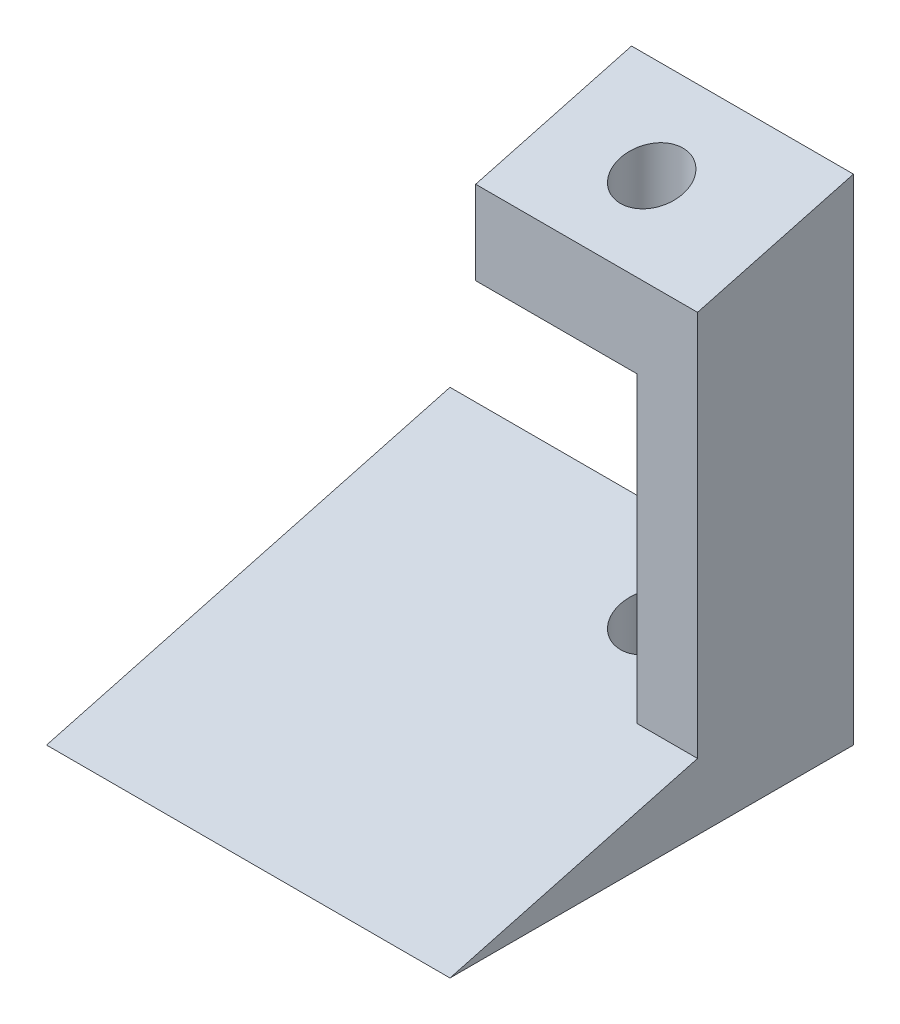
ISO-10303-21;
HEADER;
FILE_DESCRIPTION(('STEP AP214'),'2;1');
FILE_NAME('part.step','',(''),(''),'','','');
FILE_SCHEMA(('AUTOMOTIVE_DESIGN { 1 0 10303 214 1 1 1 1 }'));
ENDSEC;
DATA;
#1=APPLICATION_CONTEXT('core data for automotive mechanical design processes');
#2=APPLICATION_PROTOCOL_DEFINITION('international standard','automotive_design',2000,#1);
#3=PRODUCT_CONTEXT('',#1,'mechanical');
#4=PRODUCT('Part','Part','',(#3));
#5=PRODUCT_RELATED_PRODUCT_CATEGORY('part','',(#4));
#6=PRODUCT_DEFINITION_FORMATION('','',#4);
#7=PRODUCT_DEFINITION_CONTEXT('part definition',#1,'design');
#8=PRODUCT_DEFINITION('design','',#6,#7);
#9=PRODUCT_DEFINITION_SHAPE('','',#8);
#10=(LENGTH_UNIT() NAMED_UNIT(*) SI_UNIT(.MILLI.,.METRE.));
#11=(NAMED_UNIT(*) PLANE_ANGLE_UNIT() SI_UNIT($,.RADIAN.));
#12=(NAMED_UNIT(*) SI_UNIT($,.STERADIAN.) SOLID_ANGLE_UNIT());
#13=UNCERTAINTY_MEASURE_WITH_UNIT(LENGTH_MEASURE(1.E-05),#10,'distance_accuracy_value','');
#14=(GEOMETRIC_REPRESENTATION_CONTEXT(3) GLOBAL_UNCERTAINTY_ASSIGNED_CONTEXT((#13)) GLOBAL_UNIT_ASSIGNED_CONTEXT((#10,
#11,#12)) REPRESENTATION_CONTEXT('',''));
#15=CARTESIAN_POINT('',(0.,0.,0.));
#16=DIRECTION('',(0.,0.,1.));
#17=DIRECTION('',(1.,0.,0.));
#18=AXIS2_PLACEMENT_3D('',#15,#16,#17);
#19=CARTESIAN_POINT('',(17.,0.,0.));
#20=DIRECTION('',(1.,0.,0.));
#21=DIRECTION('',(0.,0.,-1.));
#22=AXIS2_PLACEMENT_3D('',#19,#20,#21);
#23=PLANE('',#22);
#24=DIRECTION('',(0.,-0.258819045102514,0.96592582628907));
#25=VECTOR('',#24,1.);
#26=CARTESIAN_POINT('',(17.,20.3704884645685,-20.));
#27=LINE('',#26,#25);
#28=CARTESIAN_POINT('',(17.,20.3704884645685,-20.));
#29=VERTEX_POINT('',#28);
#30=CARTESIAN_POINT('',(17.,18.2999361037484,-12.2725933896874));
#31=VERTEX_POINT('',#30);
#32=EDGE_CURVE('E128',#29,#31,#27,.T.);
#33=ORIENTED_EDGE('',*,*,#32,.F.);
#34=DIRECTION('',(0.,1.,0.));
#35=VECTOR('',#34,1.);
#36=CARTESIAN_POINT('',(17.,5.35898384862232,-20.));
#37=LINE('',#36,#35);
#38=CARTESIAN_POINT('',(17.,5.35898384862232,-20.));
#39=VERTEX_POINT('',#38);
#40=EDGE_CURVE('E49',#39,#29,#37,.T.);
#41=ORIENTED_EDGE('',*,*,#40,.F.);
#42=DIRECTION('',(0.,0.258819045102515,-0.96592582628907));
#43=VECTOR('',#42,1.);
#44=CARTESIAN_POINT('',(17.,5.35898384862232,-20.));
#45=LINE('',#44,#43);
#46=CARTESIAN_POINT('',(17.,3.2884314878022,-12.2725933896874));
#47=VERTEX_POINT('',#46);
#48=EDGE_CURVE('E80',#47,#39,#45,.T.);
#49=ORIENTED_EDGE('',*,*,#48,.F.);
#50=DIRECTION('',(0.,-1.,0.));
#51=VECTOR('',#50,1.);
#52=CARTESIAN_POINT('',(17.,22.4410408253887,-12.2725933896874));
#53=LINE('',#52,#51);
#54=EDGE_CURVE('E108',#31,#47,#53,.T.);
#55=ORIENTED_EDGE('',*,*,#54,.F.);
#56=EDGE_LOOP('',(#33,#41,#49,#55));
#57=FACE_BOUND('',#56,.T.);
#58=ADVANCED_FACE('F33',(#57),#23,.F.);
#59=CARTESIAN_POINT('',(20.,5.35898384862232,-20.));
#60=DIRECTION('',(0.,-0.96592582628907,-0.258819045102515));
#61=DIRECTION('',(0.,0.258819045102515,-0.96592582628907));
#62=AXIS2_PLACEMENT_3D('',#59,#60,#61);
#63=PLANE('',#62);
#64=CARTESIAN_POINT('',(14.,4.28718707889785,-16.));
#65=DIRECTION('',(0.,-0.96592582628907,-0.258819045102515));
#66=DIRECTION('',(0.,-0.258819045102515,0.96592582628907));
#67=AXIS2_PLACEMENT_3D('',#64,#65,#66);
#68=ELLIPSE('',#67,1.60467807963562,1.55);
#69=CARTESIAN_POINT('',(14.,3.87186583062962,-14.45));
#70=VERTEX_POINT('',#69);
#71=EDGE_CURVE('E132',#70,#70,#68,.T.);
#72=ORIENTED_EDGE('',*,*,#71,.T.);
#73=EDGE_LOOP('',(#72));
#74=FACE_BOUND('',#73,.T.);
#75=DIRECTION('',(1.,0.,0.));
#76=VECTOR('',#75,1.);
#77=CARTESIAN_POINT('',(17.,3.2884314878022,-12.2725933896874));
#78=LINE('',#77,#76);
#79=CARTESIAN_POINT('',(20.,3.2884314878022,-12.2725933896874));
#80=VERTEX_POINT('',#79);
#81=EDGE_CURVE('E94',#47,#80,#78,.T.);
#82=ORIENTED_EDGE('',*,*,#81,.F.);
#83=ORIENTED_EDGE('',*,*,#48,.T.);
#84=DIRECTION('',(-1.,0.,0.));
#85=VECTOR('',#84,1.);
#86=CARTESIAN_POINT('',(20.,5.35898384862232,-20.));
#87=LINE('',#86,#85);
#88=CARTESIAN_POINT('',(0.,5.35898384862232,-20.));
#89=VERTEX_POINT('',#88);
#90=EDGE_CURVE('E74',#39,#89,#87,.T.);
#91=ORIENTED_EDGE('',*,*,#90,.T.);
#92=DIRECTION('',(0.,-0.258819045102515,0.96592582628907));
#93=VECTOR('',#92,1.);
#94=CARTESIAN_POINT('',(0.,5.35898384862232,-20.));
#95=LINE('',#94,#93);
#96=CARTESIAN_POINT('',(0.,0.,0.));
#97=VERTEX_POINT('',#96);
#98=EDGE_CURVE('E79',#89,#97,#95,.T.);
#99=ORIENTED_EDGE('',*,*,#98,.T.);
#100=DIRECTION('',(-1.,0.,0.));
#101=VECTOR('',#100,1.);
#102=CARTESIAN_POINT('',(20.,0.,0.));
#103=LINE('',#102,#101);
#104=CARTESIAN_POINT('',(20.,0.,0.));
#105=VERTEX_POINT('',#104);
#106=EDGE_CURVE('E11',#105,#97,#103,.T.);
#107=ORIENTED_EDGE('',*,*,#106,.F.);
#108=DIRECTION('',(0.,-0.258819045102515,0.96592582628907));
#109=VECTOR('',#108,1.);
#110=CARTESIAN_POINT('',(20.,5.35898384862232,-20.));
#111=LINE('',#110,#109);
#112=EDGE_CURVE('E90',#80,#105,#111,.T.);
#113=ORIENTED_EDGE('',*,*,#112,.F.);
#114=EDGE_LOOP('',(#82,#83,#91,#99,#107,#113));
#115=FACE_BOUND('',#114,.T.);
#116=ADVANCED_FACE('F35',(#74,#115),#63,.F.);
#117=CARTESIAN_POINT('',(20.,0.,0.));
#118=DIRECTION('',(0.,1.,0.));
#119=DIRECTION('',(0.,0.,1.));
#120=AXIS2_PLACEMENT_3D('',#117,#118,#119);
#121=PLANE('',#120);
#122=CARTESIAN_POINT('',(14.,0.,-16.));
#123=DIRECTION('',(0.,-1.,0.));
#124=DIRECTION('',(0.,0.,-1.));
#125=AXIS2_PLACEMENT_3D('',#122,#123,#124);
#126=CIRCLE('',#125,1.55);
#127=CARTESIAN_POINT('',(14.,0.,-17.55));
#128=VERTEX_POINT('',#127);
#129=EDGE_CURVE('E148',#128,#128,#126,.T.);
#130=ORIENTED_EDGE('',*,*,#129,.F.);
#131=EDGE_LOOP('',(#130));
#132=FACE_BOUND('',#131,.T.);
#133=DIRECTION('',(0.,0.,-1.));
#134=VECTOR('',#133,1.);
#135=CARTESIAN_POINT('',(0.,0.,0.));
#136=LINE('',#135,#134);
#137=CARTESIAN_POINT('',(0.,0.,-20.));
#138=VERTEX_POINT('',#137);
#139=EDGE_CURVE('E91',#97,#138,#136,.T.);
#140=ORIENTED_EDGE('',*,*,#139,.T.);
#141=DIRECTION('',(-1.,0.,0.));
#142=VECTOR('',#141,1.);
#143=CARTESIAN_POINT('',(20.,0.,-20.));
#144=LINE('',#143,#142);
#145=CARTESIAN_POINT('',(20.,0.,-20.));
#146=VERTEX_POINT('',#145);
#147=EDGE_CURVE('E42',#146,#138,#144,.T.);
#148=ORIENTED_EDGE('',*,*,#147,.F.);
#149=DIRECTION('',(0.,0.,-1.));
#150=VECTOR('',#149,1.);
#151=CARTESIAN_POINT('',(20.,0.,0.));
#152=LINE('',#151,#150);
#153=EDGE_CURVE('E58',#105,#146,#152,.T.);
#154=ORIENTED_EDGE('',*,*,#153,.F.);
#155=ORIENTED_EDGE('',*,*,#106,.T.);
#156=EDGE_LOOP('',(#140,#148,#154,#155));
#157=FACE_BOUND('',#156,.T.);
#158=ADVANCED_FACE('F175',(#132,#157),#121,.F.);
#159=CARTESIAN_POINT('',(20.,0.,-20.));
#160=DIRECTION('',(0.,0.,1.));
#161=DIRECTION('',(1.,0.,0.));
#162=AXIS2_PLACEMENT_3D('',#159,#160,#161);
#163=PLANE('',#162);
#164=DIRECTION('',(0.,1.,0.));
#165=VECTOR('',#164,1.);
#166=CARTESIAN_POINT('',(0.,0.,-20.));
#167=LINE('',#166,#165);
#168=EDGE_CURVE('E86',#138,#89,#167,.T.);
#169=ORIENTED_EDGE('',*,*,#168,.T.);
#170=ORIENTED_EDGE('',*,*,#90,.F.);
#171=ORIENTED_EDGE('',*,*,#40,.T.);
#172=DIRECTION('',(1.,0.,0.));
#173=VECTOR('',#172,1.);
#174=CARTESIAN_POINT('',(9.,20.3704884645685,-20.));
#175=LINE('',#174,#173);
#176=CARTESIAN_POINT('',(9.,20.3704884645685,-20.));
#177=VERTEX_POINT('',#176);
#178=EDGE_CURVE('E117',#177,#29,#175,.T.);
#179=ORIENTED_EDGE('',*,*,#178,.F.);
#180=DIRECTION('',(0.,-1.,0.));
#181=VECTOR('',#180,1.);
#182=CARTESIAN_POINT('',(9.,24.5115931862088,-20.));
#183=LINE('',#182,#181);
#184=CARTESIAN_POINT('',(9.,24.5115931862088,-20.));
#185=VERTEX_POINT('',#184);
#186=EDGE_CURVE('E131',#185,#177,#183,.T.);
#187=ORIENTED_EDGE('',*,*,#186,.F.);
#188=DIRECTION('',(1.,0.,0.));
#189=VECTOR('',#188,1.);
#190=CARTESIAN_POINT('',(17.,24.5115931862088,-20.));
#191=LINE('',#190,#189);
#192=CARTESIAN_POINT('',(20.,24.5115931862088,-20.));
#193=VERTEX_POINT('',#192);
#194=EDGE_CURVE('E105',#185,#193,#191,.T.);
#195=ORIENTED_EDGE('',*,*,#194,.T.);
#196=DIRECTION('',(0.,1.,0.));
#197=VECTOR('',#196,1.);
#198=CARTESIAN_POINT('',(20.,0.,-20.));
#199=LINE('',#198,#197);
#200=EDGE_CURVE('E82',#146,#193,#199,.T.);
#201=ORIENTED_EDGE('',*,*,#200,.F.);
#202=ORIENTED_EDGE('',*,*,#147,.T.);
#203=EDGE_LOOP('',(#169,#170,#171,#179,#187,#195,#201,#202));
#204=FACE_BOUND('',#203,.T.);
#205=ADVANCED_FACE('F87',(#204),#163,.F.);
#206=CARTESIAN_POINT('',(20.,0.,0.));
#207=DIRECTION('',(-1.,0.,0.));
#208=DIRECTION('',(0.,0.,1.));
#209=AXIS2_PLACEMENT_3D('',#206,#207,#208);
#210=PLANE('',#209);
#211=ORIENTED_EDGE('',*,*,#200,.T.);
#212=DIRECTION('',(0.,-0.258819045102515,0.96592582628907));
#213=VECTOR('',#212,1.);
#214=CARTESIAN_POINT('',(20.,24.5115931862088,-20.));
#215=LINE('',#214,#213);
#216=CARTESIAN_POINT('',(20.,22.4410408253887,-12.2725933896874));
#217=VERTEX_POINT('',#216);
#218=EDGE_CURVE('E114',#193,#217,#215,.T.);
#219=ORIENTED_EDGE('',*,*,#218,.T.);
#220=DIRECTION('',(0.,-1.,0.));
#221=VECTOR('',#220,1.);
#222=CARTESIAN_POINT('',(20.,22.4410408253887,-12.2725933896874));
#223=LINE('',#222,#221);
#224=EDGE_CURVE('E111',#217,#80,#223,.T.);
#225=ORIENTED_EDGE('',*,*,#224,.T.);
#226=ORIENTED_EDGE('',*,*,#112,.T.);
#227=ORIENTED_EDGE('',*,*,#153,.T.);
#228=EDGE_LOOP('',(#211,#219,#225,#226,#227));
#229=FACE_BOUND('',#228,.T.);
#230=ADVANCED_FACE('F187',(#229),#210,.F.);
#231=CARTESIAN_POINT('',(0.,0.,0.));
#232=DIRECTION('',(-1.,0.,0.));
#233=DIRECTION('',(0.,0.,1.));
#234=AXIS2_PLACEMENT_3D('',#231,#232,#233);
#235=PLANE('',#234);
#236=ORIENTED_EDGE('',*,*,#98,.F.);
#237=ORIENTED_EDGE('',*,*,#168,.F.);
#238=ORIENTED_EDGE('',*,*,#139,.F.);
#239=EDGE_LOOP('',(#236,#237,#238));
#240=FACE_BOUND('',#239,.T.);
#241=ADVANCED_FACE('F93',(#240),#235,.T.);
#242=CARTESIAN_POINT('',(17.,22.4410408253887,-12.2725933896874));
#243=DIRECTION('',(0.,0.,1.));
#244=DIRECTION('',(0.,-1.,0.));
#245=AXIS2_PLACEMENT_3D('',#242,#243,#244);
#246=PLANE('',#245);
#247=ORIENTED_EDGE('',*,*,#224,.F.);
#248=DIRECTION('',(1.,0.,0.));
#249=VECTOR('',#248,1.);
#250=CARTESIAN_POINT('',(17.,22.4410408253887,-12.2725933896874));
#251=LINE('',#250,#249);
#252=CARTESIAN_POINT('',(9.,22.4410408253887,-12.2725933896874));
#253=VERTEX_POINT('',#252);
#254=EDGE_CURVE('E98',#253,#217,#251,.T.);
#255=ORIENTED_EDGE('',*,*,#254,.F.);
#256=DIRECTION('',(0.,1.,0.));
#257=VECTOR('',#256,1.);
#258=CARTESIAN_POINT('',(9.,22.4410408253887,-12.2725933896874));
#259=LINE('',#258,#257);
#260=CARTESIAN_POINT('',(9.,18.2999361037484,-12.2725933896874));
#261=VERTEX_POINT('',#260);
#262=EDGE_CURVE('E135',#261,#253,#259,.T.);
#263=ORIENTED_EDGE('',*,*,#262,.F.);
#264=DIRECTION('',(1.,0.,0.));
#265=VECTOR('',#264,1.);
#266=CARTESIAN_POINT('',(9.,18.2999361037484,-12.2725933896874));
#267=LINE('',#266,#265);
#268=EDGE_CURVE('E124',#261,#31,#267,.T.);
#269=ORIENTED_EDGE('',*,*,#268,.T.);
#270=ORIENTED_EDGE('',*,*,#54,.T.);
#271=ORIENTED_EDGE('',*,*,#81,.T.);
#272=EDGE_LOOP('',(#247,#255,#263,#269,#270,#271));
#273=FACE_BOUND('',#272,.T.);
#274=ADVANCED_FACE('F179',(#273),#246,.T.);
#275=CARTESIAN_POINT('',(17.,24.5115931862088,-20.));
#276=DIRECTION('',(0.,0.96592582628907,0.258819045102515));
#277=DIRECTION('',(0.,-0.258819045102515,0.96592582628907));
#278=AXIS2_PLACEMENT_3D('',#275,#276,#277);
#279=PLANE('',#278);
#280=CARTESIAN_POINT('',(14.,23.4397964164843,-16.));
#281=DIRECTION('',(0.,0.96592582628907,0.258819045102515));
#282=DIRECTION('',(0.,-0.258819045102515,0.96592582628907));
#283=AXIS2_PLACEMENT_3D('',#280,#281,#282);
#284=ELLIPSE('',#283,1.60467807963562,1.55);
#285=CARTESIAN_POINT('',(14.,23.0244751682161,-14.45));
#286=VERTEX_POINT('',#285);
#287=EDGE_CURVE('E145',#286,#286,#284,.T.);
#288=ORIENTED_EDGE('',*,*,#287,.F.);
#289=EDGE_LOOP('',(#288));
#290=FACE_BOUND('',#289,.T.);
#291=ORIENTED_EDGE('',*,*,#218,.F.);
#292=ORIENTED_EDGE('',*,*,#194,.F.);
#293=DIRECTION('',(0.,0.258819045102515,-0.96592582628907));
#294=VECTOR('',#293,1.);
#295=CARTESIAN_POINT('',(9.,24.5115931862088,-20.));
#296=LINE('',#295,#294);
#297=EDGE_CURVE('E127',#253,#185,#296,.T.);
#298=ORIENTED_EDGE('',*,*,#297,.F.);
#299=ORIENTED_EDGE('',*,*,#254,.T.);
#300=EDGE_LOOP('',(#291,#292,#298,#299));
#301=FACE_BOUND('',#300,.T.);
#302=ADVANCED_FACE('F182',(#290,#301),#279,.T.);
#303=CARTESIAN_POINT('',(9.,20.3704884645685,-20.));
#304=DIRECTION('',(0.,0.96592582628907,0.258819045102514));
#305=DIRECTION('',(0.,-0.258819045102514,0.96592582628907));
#306=AXIS2_PLACEMENT_3D('',#303,#304,#305);
#307=PLANE('',#306);
#308=CARTESIAN_POINT('',(14.,19.298691694844,-16.));
#309=DIRECTION('',(0.,0.96592582628907,0.258819045102514));
#310=DIRECTION('',(0.,-0.258819045102514,0.96592582628907));
#311=AXIS2_PLACEMENT_3D('',#308,#309,#310);
#312=ELLIPSE('',#311,1.60467807963562,1.55);
#313=CARTESIAN_POINT('',(14.,18.8833704465758,-14.45));
#314=VERTEX_POINT('',#313);
#315=EDGE_CURVE('E37',#314,#314,#312,.T.);
#316=ORIENTED_EDGE('',*,*,#315,.T.);
#317=EDGE_LOOP('',(#316));
#318=FACE_BOUND('',#317,.T.);
#319=ORIENTED_EDGE('',*,*,#32,.T.);
#320=ORIENTED_EDGE('',*,*,#268,.F.);
#321=DIRECTION('',(0.,-0.258819045102514,0.96592582628907));
#322=VECTOR('',#321,1.);
#323=CARTESIAN_POINT('',(9.,20.3704884645685,-20.));
#324=LINE('',#323,#322);
#325=EDGE_CURVE('E138',#177,#261,#324,.T.);
#326=ORIENTED_EDGE('',*,*,#325,.F.);
#327=ORIENTED_EDGE('',*,*,#178,.T.);
#328=EDGE_LOOP('',(#319,#320,#326,#327));
#329=FACE_BOUND('',#328,.T.);
#330=ADVANCED_FACE('F155',(#318,#329),#307,.F.);
#331=CARTESIAN_POINT('',(9.,0.,0.));
#332=DIRECTION('',(-1.,0.,0.));
#333=DIRECTION('',(0.,0.,1.));
#334=AXIS2_PLACEMENT_3D('',#331,#332,#333);
#335=PLANE('',#334);
#336=ORIENTED_EDGE('',*,*,#186,.T.);
#337=ORIENTED_EDGE('',*,*,#325,.T.);
#338=ORIENTED_EDGE('',*,*,#262,.T.);
#339=ORIENTED_EDGE('',*,*,#297,.T.);
#340=EDGE_LOOP('',(#336,#337,#338,#339));
#341=FACE_BOUND('',#340,.T.);
#342=ADVANCED_FACE('F161',(#341),#335,.T.);
#343=CARTESIAN_POINT('',(14.,30.,-16.));
#344=DIRECTION('',(0.,-1.,0.));
#345=DIRECTION('',(0.,0.,-1.));
#346=AXIS2_PLACEMENT_3D('',#343,#344,#345);
#347=CYLINDRICAL_SURFACE('',#346,1.55);
#348=ORIENTED_EDGE('',*,*,#287,.T.);
#349=EDGE_LOOP('',(#348));
#350=FACE_BOUND('',#349,.T.);
#351=ORIENTED_EDGE('',*,*,#315,.F.);
#352=EDGE_LOOP('',(#351));
#353=FACE_BOUND('',#352,.T.);
#354=ADVANCED_FACE('F158',(#350,#353),#347,.F.);
#355=ORIENTED_EDGE('',*,*,#129,.T.);
#356=EDGE_LOOP('',(#355));
#357=FACE_BOUND('',#356,.T.);
#358=ORIENTED_EDGE('',*,*,#71,.F.);
#359=EDGE_LOOP('',(#358));
#360=FACE_BOUND('',#359,.T.);
#361=ADVANCED_FACE('F160',(#357,#360),#347,.F.);
#362=CLOSED_SHELL('',(#58,#116,#158,#205,#230,#241,#274,#302,#330,#342,#354,#361));
#363=MANIFOLD_SOLID_BREP('B2',#362);
#364=ADVANCED_BREP_SHAPE_REPRESENTATION('',(#18,#363),#14);
#365=SHAPE_DEFINITION_REPRESENTATION(#9,#364);
ENDSEC;
END-ISO-10303-21;
